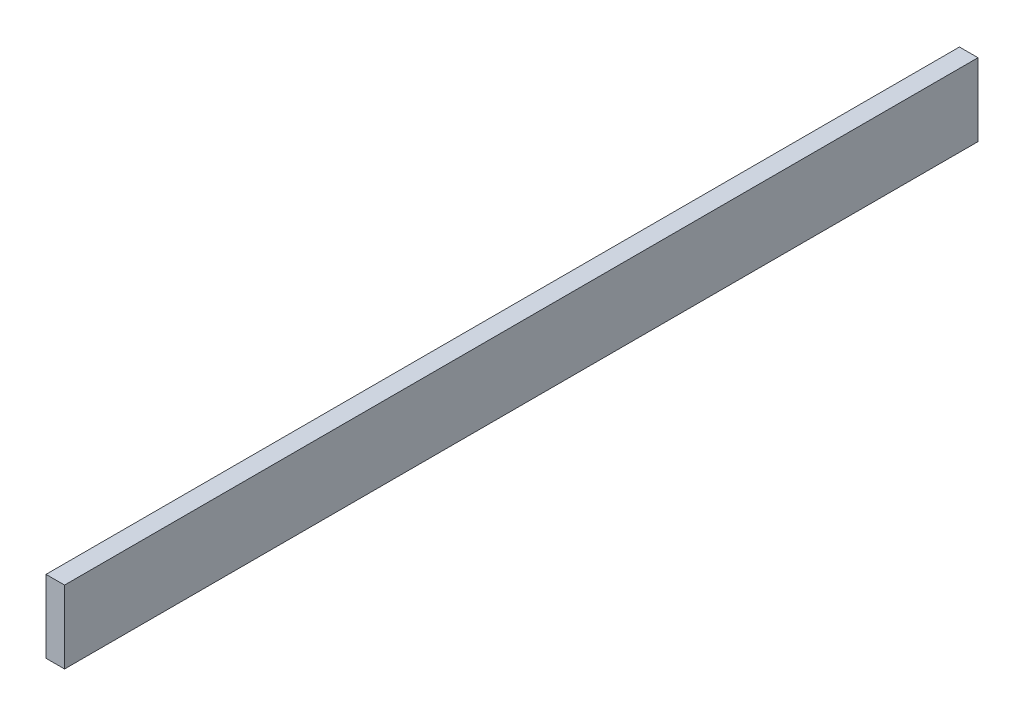
ISO-10303-21;
HEADER;
FILE_DESCRIPTION(('STEP AP214'),'2;1');
FILE_NAME('part.step','',(''),(''),'','','');
FILE_SCHEMA(('AUTOMOTIVE_DESIGN { 1 0 10303 214 1 1 1 1 }'));
ENDSEC;
DATA;
#1=APPLICATION_CONTEXT('core data for automotive mechanical design processes');
#2=APPLICATION_PROTOCOL_DEFINITION('international standard','automotive_design',2000,#1);
#3=PRODUCT_CONTEXT('',#1,'mechanical');
#4=PRODUCT('Part','Part','',(#3));
#5=PRODUCT_RELATED_PRODUCT_CATEGORY('part','',(#4));
#6=PRODUCT_DEFINITION_FORMATION('','',#4);
#7=PRODUCT_DEFINITION_CONTEXT('part definition',#1,'design');
#8=PRODUCT_DEFINITION('design','',#6,#7);
#9=PRODUCT_DEFINITION_SHAPE('','',#8);
#10=(LENGTH_UNIT() NAMED_UNIT(*) SI_UNIT(.MILLI.,.METRE.));
#11=(NAMED_UNIT(*) PLANE_ANGLE_UNIT() SI_UNIT($,.RADIAN.));
#12=(NAMED_UNIT(*) SI_UNIT($,.STERADIAN.) SOLID_ANGLE_UNIT());
#13=UNCERTAINTY_MEASURE_WITH_UNIT(LENGTH_MEASURE(1.E-05),#10,'distance_accuracy_value','');
#14=(GEOMETRIC_REPRESENTATION_CONTEXT(3) GLOBAL_UNCERTAINTY_ASSIGNED_CONTEXT((#13)) GLOBAL_UNIT_ASSIGNED_CONTEXT((#10,
#11,#12)) REPRESENTATION_CONTEXT('',''));
#15=CARTESIAN_POINT('',(0.,0.,0.));
#16=DIRECTION('',(0.,0.,1.));
#17=DIRECTION('',(1.,0.,0.));
#18=AXIS2_PLACEMENT_3D('',#15,#16,#17);
#19=CARTESIAN_POINT('',(-10.16,39.793333164,1000.));
#20=DIRECTION('',(1.,0.,0.));
#21=DIRECTION('',(0.,1.,0.));
#22=AXIS2_PLACEMENT_3D('',#19,#20,#21);
#23=PLANE('',#22);
#24=DIRECTION('',(0.,-1.,0.));
#25=VECTOR('',#24,1.);
#26=CARTESIAN_POINT('',(-10.16,39.793333164,0.));
#27=LINE('',#26,#25);
#28=CARTESIAN_POINT('',(-10.16,39.793333164,0.));
#29=VERTEX_POINT('',#28);
#30=CARTESIAN_POINT('',(-10.16,-39.793333164,0.));
#31=VERTEX_POINT('',#30);
#32=EDGE_CURVE('E98',#29,#31,#27,.T.);
#33=ORIENTED_EDGE('',*,*,#32,.T.);
#34=DIRECTION('',(0.,0.,-1.));
#35=VECTOR('',#34,1.);
#36=CARTESIAN_POINT('',(-10.16,-39.793333164,1000.));
#37=LINE('',#36,#35);
#38=CARTESIAN_POINT('',(-10.16,-39.793333164,1000.));
#39=VERTEX_POINT('',#38);
#40=EDGE_CURVE('E11',#39,#31,#37,.T.);
#41=ORIENTED_EDGE('',*,*,#40,.F.);
#42=DIRECTION('',(0.,-1.,0.));
#43=VECTOR('',#42,1.);
#44=CARTESIAN_POINT('',(-10.16,39.793333164,1000.));
#45=LINE('',#44,#43);
#46=CARTESIAN_POINT('',(-10.16,39.793333164,1000.));
#47=VERTEX_POINT('',#46);
#48=EDGE_CURVE('E86',#47,#39,#45,.T.);
#49=ORIENTED_EDGE('',*,*,#48,.F.);
#50=DIRECTION('',(0.,0.,-1.));
#51=VECTOR('',#50,1.);
#52=CARTESIAN_POINT('',(-10.16,39.793333164,1000.));
#53=LINE('',#52,#51);
#54=EDGE_CURVE('E94',#47,#29,#53,.T.);
#55=ORIENTED_EDGE('',*,*,#54,.T.);
#56=EDGE_LOOP('',(#33,#41,#49,#55));
#57=FACE_BOUND('',#56,.T.);
#58=ADVANCED_FACE('F35',(#57),#23,.F.);
#59=CARTESIAN_POINT('',(10.16,-39.793333164,1000.));
#60=DIRECTION('',(0.,1.,0.));
#61=DIRECTION('',(0.,0.,1.));
#62=AXIS2_PLACEMENT_3D('',#59,#60,#61);
#63=PLANE('',#62);
#64=DIRECTION('',(1.,0.,0.));
#65=VECTOR('',#64,1.);
#66=CARTESIAN_POINT('',(10.16,-39.793333164,0.));
#67=LINE('',#66,#65);
#68=CARTESIAN_POINT('',(10.16,-39.793333164,0.));
#69=VERTEX_POINT('',#68);
#70=EDGE_CURVE('E90',#31,#69,#67,.T.);
#71=ORIENTED_EDGE('',*,*,#70,.T.);
#72=DIRECTION('',(0.,0.,-1.));
#73=VECTOR('',#72,1.);
#74=CARTESIAN_POINT('',(10.16,-39.793333164,1000.));
#75=LINE('',#74,#73);
#76=CARTESIAN_POINT('',(10.16,-39.793333164,1000.));
#77=VERTEX_POINT('',#76);
#78=EDGE_CURVE('E43',#77,#69,#75,.T.);
#79=ORIENTED_EDGE('',*,*,#78,.F.);
#80=DIRECTION('',(1.,0.,0.));
#81=VECTOR('',#80,1.);
#82=CARTESIAN_POINT('',(10.16,-39.793333164,1000.));
#83=LINE('',#82,#81);
#84=EDGE_CURVE('E81',#39,#77,#83,.T.);
#85=ORIENTED_EDGE('',*,*,#84,.F.);
#86=ORIENTED_EDGE('',*,*,#40,.T.);
#87=EDGE_LOOP('',(#71,#79,#85,#86));
#88=FACE_BOUND('',#87,.T.);
#89=ADVANCED_FACE('F89',(#88),#63,.F.);
#90=CARTESIAN_POINT('',(10.16,39.793333164,1000.));
#91=DIRECTION('',(-1.,0.,0.));
#92=DIRECTION('',(0.,-1.,0.));
#93=AXIS2_PLACEMENT_3D('',#90,#91,#92);
#94=PLANE('',#93);
#95=DIRECTION('',(0.,1.,0.));
#96=VECTOR('',#95,1.);
#97=CARTESIAN_POINT('',(10.16,39.793333164,0.));
#98=LINE('',#97,#96);
#99=CARTESIAN_POINT('',(10.16,39.793333164,0.));
#100=VERTEX_POINT('',#99);
#101=EDGE_CURVE('E68',#69,#100,#98,.T.);
#102=ORIENTED_EDGE('',*,*,#101,.T.);
#103=DIRECTION('',(0.,0.,-1.));
#104=VECTOR('',#103,1.);
#105=CARTESIAN_POINT('',(10.16,39.793333164,1000.));
#106=LINE('',#105,#104);
#107=CARTESIAN_POINT('',(10.16,39.793333164,1000.));
#108=VERTEX_POINT('',#107);
#109=EDGE_CURVE('E91',#108,#100,#106,.T.);
#110=ORIENTED_EDGE('',*,*,#109,.F.);
#111=DIRECTION('',(0.,1.,0.));
#112=VECTOR('',#111,1.);
#113=CARTESIAN_POINT('',(10.16,39.793333164,1000.));
#114=LINE('',#113,#112);
#115=EDGE_CURVE('E84',#77,#108,#114,.T.);
#116=ORIENTED_EDGE('',*,*,#115,.F.);
#117=ORIENTED_EDGE('',*,*,#78,.T.);
#118=EDGE_LOOP('',(#102,#110,#116,#117));
#119=FACE_BOUND('',#118,.T.);
#120=ADVANCED_FACE('F92',(#119),#94,.F.);
#121=CARTESIAN_POINT('',(10.16,39.793333164,1000.));
#122=DIRECTION('',(0.,-1.,0.));
#123=DIRECTION('',(1.,0.,0.));
#124=AXIS2_PLACEMENT_3D('',#121,#122,#123);
#125=PLANE('',#124);
#126=DIRECTION('',(-1.,0.,0.));
#127=VECTOR('',#126,1.);
#128=CARTESIAN_POINT('',(10.16,39.793333164,0.));
#129=LINE('',#128,#127);
#130=EDGE_CURVE('E74',#100,#29,#129,.T.);
#131=ORIENTED_EDGE('',*,*,#130,.T.);
#132=ORIENTED_EDGE('',*,*,#54,.F.);
#133=DIRECTION('',(-1.,0.,0.));
#134=VECTOR('',#133,1.);
#135=CARTESIAN_POINT('',(10.16,39.793333164,1000.));
#136=LINE('',#135,#134);
#137=EDGE_CURVE('E51',#108,#47,#136,.T.);
#138=ORIENTED_EDGE('',*,*,#137,.F.);
#139=ORIENTED_EDGE('',*,*,#109,.T.);
#140=EDGE_LOOP('',(#131,#132,#138,#139));
#141=FACE_BOUND('',#140,.T.);
#142=ADVANCED_FACE('F105',(#141),#125,.F.);
#143=CARTESIAN_POINT('',(0.,0.,1000.));
#144=DIRECTION('',(0.,0.,-1.));
#145=DIRECTION('',(-1.,0.,0.));
#146=AXIS2_PLACEMENT_3D('',#143,#144,#145);
#147=PLANE('',#146);
#148=ORIENTED_EDGE('',*,*,#48,.T.);
#149=ORIENTED_EDGE('',*,*,#84,.T.);
#150=ORIENTED_EDGE('',*,*,#115,.T.);
#151=ORIENTED_EDGE('',*,*,#137,.T.);
#152=EDGE_LOOP('',(#148,#149,#150,#151));
#153=FACE_BOUND('',#152,.T.);
#154=ADVANCED_FACE('F82',(#153),#147,.F.);
#155=CARTESIAN_POINT('',(0.,0.,0.));
#156=DIRECTION('',(0.,0.,-1.));
#157=DIRECTION('',(-1.,0.,0.));
#158=AXIS2_PLACEMENT_3D('',#155,#156,#157);
#159=PLANE('',#158);
#160=ORIENTED_EDGE('',*,*,#32,.F.);
#161=ORIENTED_EDGE('',*,*,#130,.F.);
#162=ORIENTED_EDGE('',*,*,#101,.F.);
#163=ORIENTED_EDGE('',*,*,#70,.F.);
#164=EDGE_LOOP('',(#160,#161,#162,#163));
#165=FACE_BOUND('',#164,.T.);
#166=ADVANCED_FACE('F108',(#165),#159,.T.);
#167=CLOSED_SHELL('',(#58,#89,#120,#142,#154,#166));
#168=MANIFOLD_SOLID_BREP('B2',#167);
#169=ADVANCED_BREP_SHAPE_REPRESENTATION('',(#18,#168),#14);
#170=SHAPE_DEFINITION_REPRESENTATION(#9,#169);
ENDSEC;
END-ISO-10303-21;
